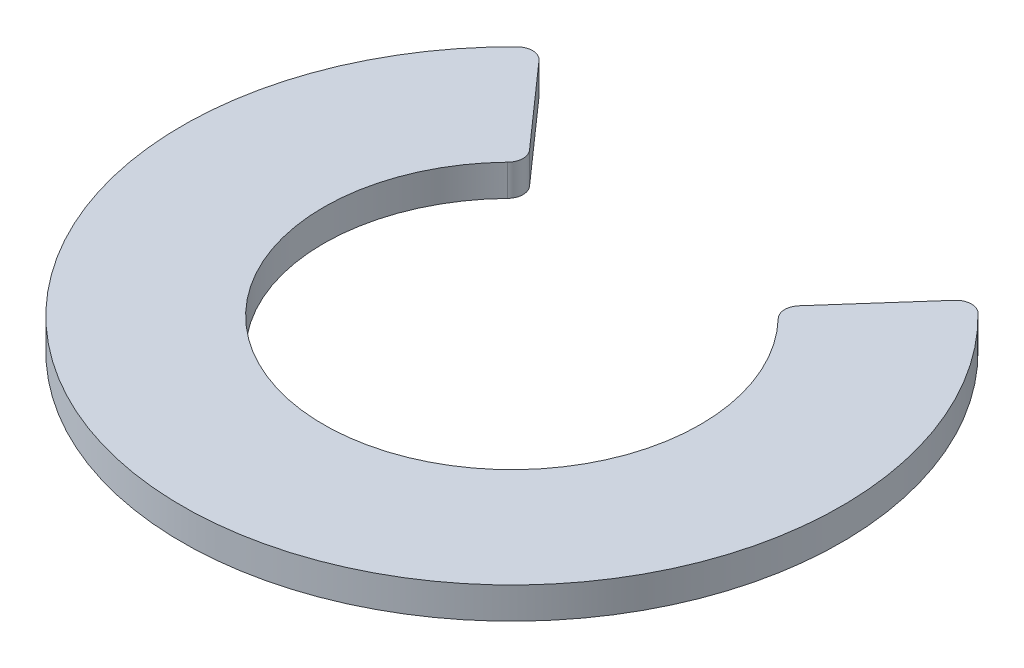
ISO-10303-21;
HEADER;
FILE_DESCRIPTION(('STEP AP214'),'2;1');
FILE_NAME('part.step','',(''),(''),'','','');
FILE_SCHEMA(('AUTOMOTIVE_DESIGN { 1 0 10303 214 1 1 1 1 }'));
ENDSEC;
DATA;
#1=APPLICATION_CONTEXT('core data for automotive mechanical design processes');
#2=APPLICATION_PROTOCOL_DEFINITION('international standard','automotive_design',2000,#1);
#3=PRODUCT_CONTEXT('',#1,'mechanical');
#4=PRODUCT('Part','Part','',(#3));
#5=PRODUCT_RELATED_PRODUCT_CATEGORY('part','',(#4));
#6=PRODUCT_DEFINITION_FORMATION('','',#4);
#7=PRODUCT_DEFINITION_CONTEXT('part definition',#1,'design');
#8=PRODUCT_DEFINITION('design','',#6,#7);
#9=PRODUCT_DEFINITION_SHAPE('','',#8);
#10=(LENGTH_UNIT() NAMED_UNIT(*) SI_UNIT(.MILLI.,.METRE.));
#11=(NAMED_UNIT(*) PLANE_ANGLE_UNIT() SI_UNIT($,.RADIAN.));
#12=(NAMED_UNIT(*) SI_UNIT($,.STERADIAN.) SOLID_ANGLE_UNIT());
#13=UNCERTAINTY_MEASURE_WITH_UNIT(LENGTH_MEASURE(1.E-05),#10,'distance_accuracy_value','');
#14=(GEOMETRIC_REPRESENTATION_CONTEXT(3) GLOBAL_UNCERTAINTY_ASSIGNED_CONTEXT((#13)) GLOBAL_UNIT_ASSIGNED_CONTEXT((#10,
#11,#12)) REPRESENTATION_CONTEXT('',''));
#15=CARTESIAN_POINT('',(0.,0.,0.));
#16=DIRECTION('',(0.,0.,1.));
#17=DIRECTION('',(1.,0.,0.));
#18=AXIS2_PLACEMENT_3D('',#15,#16,#17);
#19=CARTESIAN_POINT('',(0.,0.2,0.));
#20=DIRECTION('',(0.,-1.,0.));
#21=DIRECTION('',(0.,0.,-1.));
#22=AXIS2_PLACEMENT_3D('',#19,#20,#21);
#23=CYLINDRICAL_SURFACE('',#22,2.1);
#24=CARTESIAN_POINT('',(0.,0.,0.));
#25=DIRECTION('',(0.,1.,0.));
#26=DIRECTION('',(0.,0.,1.));
#27=AXIS2_PLACEMENT_3D('',#24,#25,#26);
#28=CIRCLE('',#27,2.1);
#29=CARTESIAN_POINT('',(-1.46836085583703,0.,-1.5013048980955));
#30=VERTEX_POINT('',#29);
#31=CARTESIAN_POINT('',(1.46836085583703,0.,-1.5013048980955));
#32=VERTEX_POINT('',#31);
#33=EDGE_CURVE('E129',#30,#32,#28,.T.);
#34=ORIENTED_EDGE('',*,*,#33,.T.);
#35=DIRECTION('',(0.,-1.,0.));
#36=VECTOR('',#35,1.);
#37=CARTESIAN_POINT('',(1.46836085583703,0.2,-1.5013048980955));
#38=LINE('',#37,#36);
#39=CARTESIAN_POINT('',(1.46836085583703,0.2,-1.5013048980955));
#40=VERTEX_POINT('',#39);
#41=EDGE_CURVE('E152',#32,#40,#38,.F.);
#42=ORIENTED_EDGE('',*,*,#41,.T.);
#43=CARTESIAN_POINT('',(0.,0.2,0.));
#44=DIRECTION('',(0.,1.,0.));
#45=DIRECTION('',(0.,0.,1.));
#46=AXIS2_PLACEMENT_3D('',#43,#44,#45);
#47=CIRCLE('',#46,2.1);
#48=CARTESIAN_POINT('',(-1.46836085583703,0.2,-1.5013048980955));
#49=VERTEX_POINT('',#48);
#50=EDGE_CURVE('E127',#49,#40,#47,.T.);
#51=ORIENTED_EDGE('',*,*,#50,.F.);
#52=DIRECTION('',(0.,-1.,0.));
#53=VECTOR('',#52,1.);
#54=CARTESIAN_POINT('',(-1.46836085583703,0.2,-1.5013048980955));
#55=LINE('',#54,#53);
#56=EDGE_CURVE('E149',#49,#30,#55,.T.);
#57=ORIENTED_EDGE('',*,*,#56,.T.);
#58=EDGE_LOOP('',(#34,#42,#51,#57));
#59=FACE_BOUND('',#58,.T.);
#60=ADVANCED_FACE('F34',(#59),#23,.T.);
#61=CARTESIAN_POINT('',(0.795119435011055,0.2,-0.89876864880107));
#62=DIRECTION('',(0.748973874000887,0.,0.662599529175885));
#63=DIRECTION('',(0.662599529175885,0.,-0.748973874000887));
#64=AXIS2_PLACEMENT_3D('',#61,#62,#63);
#65=PLANE('',#64);
#66=DIRECTION('',(-0.662599529175885,0.,0.748973874000887));
#67=VECTOR('',#66,1.);
#68=CARTESIAN_POINT('',(0.795119435011055,0.,-0.89876864880107));
#69=LINE('',#68,#67);
#70=CARTESIAN_POINT('',(1.32354152292089,0.,-1.49607414157997));
#71=VERTEX_POINT('',#70);
#72=CARTESIAN_POINT('',(0.858827147095202,0.,-0.970781093456356));
#73=VERTEX_POINT('',#72);
#74=EDGE_CURVE('E125',#71,#73,#69,.T.);
#75=ORIENTED_EDGE('',*,*,#74,.T.);
#76=DIRECTION('',(0.,-1.,0.));
#77=VECTOR('',#76,1.);
#78=CARTESIAN_POINT('',(0.858827147095202,0.2,-0.970781093456356));
#79=LINE('',#78,#77);
#80=CARTESIAN_POINT('',(0.858827147095202,0.2,-0.970781093456356));
#81=VERTEX_POINT('',#80);
#82=EDGE_CURVE('E104',#73,#81,#79,.F.);
#83=ORIENTED_EDGE('',*,*,#82,.T.);
#84=DIRECTION('',(-0.662599529175885,0.,0.748973874000887));
#85=VECTOR('',#84,1.);
#86=CARTESIAN_POINT('',(0.795119435011055,0.2,-0.89876864880107));
#87=LINE('',#86,#85);
#88=CARTESIAN_POINT('',(1.32354152292089,0.2,-1.49607414157997));
#89=VERTEX_POINT('',#88);
#90=EDGE_CURVE('E168',#89,#81,#87,.T.);
#91=ORIENTED_EDGE('',*,*,#90,.F.);
#92=DIRECTION('',(0.,-1.,0.));
#93=VECTOR('',#92,1.);
#94=CARTESIAN_POINT('',(1.32354152292089,0.2,-1.49607414157997));
#95=LINE('',#94,#93);
#96=EDGE_CURVE('E109',#89,#71,#95,.T.);
#97=ORIENTED_EDGE('',*,*,#96,.T.);
#98=EDGE_LOOP('',(#75,#83,#91,#97));
#99=FACE_BOUND('',#98,.T.);
#100=ADVANCED_FACE('F185',(#99),#65,.F.);
#101=CARTESIAN_POINT('',(0.,0.2,0.));
#102=DIRECTION('',(0.,-1.,0.));
#103=DIRECTION('',(0.,0.,-1.));
#104=AXIS2_PLACEMENT_3D('',#101,#102,#103);
#105=CYLINDRICAL_SURFACE('',#104,1.2);
#106=CARTESIAN_POINT('',(0.,0.2,0.));
#107=DIRECTION('',(0.,-1.,0.));
#108=DIRECTION('',(0.,0.,1.));
#109=AXIS2_PLACEMENT_3D('',#106,#107,#108);
#110=CIRCLE('',#109,1.2);
#111=CARTESIAN_POINT('',(0.861899570303345,0.2,-0.834942591266555));
#112=VERTEX_POINT('',#111);
#113=CARTESIAN_POINT('',(-0.861899570303345,0.2,-0.834942591266555));
#114=VERTEX_POINT('',#113);
#115=EDGE_CURVE('E118',#112,#114,#110,.T.);
#116=ORIENTED_EDGE('',*,*,#115,.F.);
#117=DIRECTION('',(0.,-1.,0.));
#118=VECTOR('',#117,1.);
#119=CARTESIAN_POINT('',(0.861899570303345,0.2,-0.834942591266555));
#120=LINE('',#119,#118);
#121=CARTESIAN_POINT('',(0.861899570303345,0.,-0.834942591266555));
#122=VERTEX_POINT('',#121);
#123=EDGE_CURVE('E103',#112,#122,#120,.T.);
#124=ORIENTED_EDGE('',*,*,#123,.T.);
#125=CARTESIAN_POINT('',(0.,0.,0.));
#126=DIRECTION('',(0.,-1.,0.));
#127=DIRECTION('',(0.,0.,1.));
#128=AXIS2_PLACEMENT_3D('',#125,#126,#127);
#129=CIRCLE('',#128,1.2);
#130=CARTESIAN_POINT('',(-0.861899570303345,0.,-0.834942591266555));
#131=VERTEX_POINT('',#130);
#132=EDGE_CURVE('E116',#122,#131,#129,.T.);
#133=ORIENTED_EDGE('',*,*,#132,.T.);
#134=DIRECTION('',(0.,-1.,0.));
#135=VECTOR('',#134,1.);
#136=CARTESIAN_POINT('',(-0.861899570303345,0.2,-0.834942591266555));
#137=LINE('',#136,#135);
#138=EDGE_CURVE('E120',#131,#114,#137,.F.);
#139=ORIENTED_EDGE('',*,*,#138,.T.);
#140=EDGE_LOOP('',(#116,#124,#133,#139));
#141=FACE_BOUND('',#140,.T.);
#142=ADVANCED_FACE('F115',(#141),#105,.F.);
#143=CARTESIAN_POINT('',(-1.39145901126935,0.2,-1.57284513540187));
#144=DIRECTION('',(-0.748973874000887,0.,0.662599529175885));
#145=DIRECTION('',(0.662599529175885,0.,0.748973874000887));
#146=AXIS2_PLACEMENT_3D('',#143,#144,#145);
#147=PLANE('',#146);
#148=DIRECTION('',(-0.662599529175885,0.,-0.748973874000887));
#149=VECTOR('',#148,1.);
#150=CARTESIAN_POINT('',(-1.39145901126935,0.,-1.57284513540187));
#151=LINE('',#150,#149);
#152=CARTESIAN_POINT('',(-0.858827147095202,0.,-0.970781093456356));
#153=VERTEX_POINT('',#152);
#154=CARTESIAN_POINT('',(-1.32354152292089,0.,-1.49607414157997));
#155=VERTEX_POINT('',#154);
#156=EDGE_CURVE('E124',#153,#155,#151,.T.);
#157=ORIENTED_EDGE('',*,*,#156,.T.);
#158=DIRECTION('',(0.,-1.,0.));
#159=VECTOR('',#158,1.);
#160=CARTESIAN_POINT('',(-1.32354152292089,0.2,-1.49607414157997));
#161=LINE('',#160,#159);
#162=CARTESIAN_POINT('',(-1.32354152292089,0.2,-1.49607414157997));
#163=VERTEX_POINT('',#162);
#164=EDGE_CURVE('E11',#155,#163,#161,.F.);
#165=ORIENTED_EDGE('',*,*,#164,.T.);
#166=DIRECTION('',(-0.662599529175885,0.,-0.748973874000887));
#167=VECTOR('',#166,1.);
#168=CARTESIAN_POINT('',(-1.39145901126935,0.2,-1.57284513540187));
#169=LINE('',#168,#167);
#170=CARTESIAN_POINT('',(-0.858827147095202,0.2,-0.970781093456356));
#171=VERTEX_POINT('',#170);
#172=EDGE_CURVE('E133',#171,#163,#169,.T.);
#173=ORIENTED_EDGE('',*,*,#172,.F.);
#174=DIRECTION('',(0.,-1.,0.));
#175=VECTOR('',#174,1.);
#176=CARTESIAN_POINT('',(-0.858827147095202,0.2,-0.970781093456356));
#177=LINE('',#176,#175);
#178=EDGE_CURVE('E42',#171,#153,#177,.T.);
#179=ORIENTED_EDGE('',*,*,#178,.T.);
#180=EDGE_LOOP('',(#157,#165,#173,#179));
#181=FACE_BOUND('',#180,.T.);
#182=ADVANCED_FACE('F155',(#181),#147,.F.);
#183=CARTESIAN_POINT('',(0.,0.2,0.));
#184=DIRECTION('',(0.,1.,0.));
#185=DIRECTION('',(0.,0.,1.));
#186=AXIS2_PLACEMENT_3D('',#183,#184,#185);
#187=PLANE('',#186);
#188=ORIENTED_EDGE('',*,*,#90,.T.);
#189=CARTESIAN_POINT('',(0.933724534495291,0.2,-0.904521140538768));
#190=DIRECTION('',(0.,1.,0.));
#191=DIRECTION('',(0.,0.,1.));
#192=AXIS2_PLACEMENT_3D('',#189,#190,#191);
#193=CIRCLE('',#192,0.1);
#194=EDGE_CURVE('E147',#81,#112,#193,.T.);
#195=ORIENTED_EDGE('',*,*,#194,.T.);
#196=ORIENTED_EDGE('',*,*,#115,.T.);
#197=CARTESIAN_POINT('',(-0.933724534495291,0.2,-0.904521140538768));
#198=DIRECTION('',(0.,1.,0.));
#199=DIRECTION('',(0.,0.,1.));
#200=AXIS2_PLACEMENT_3D('',#197,#198,#199);
#201=CIRCLE('',#200,0.1);
#202=EDGE_CURVE('E54',#114,#171,#201,.T.);
#203=ORIENTED_EDGE('',*,*,#202,.T.);
#204=ORIENTED_EDGE('',*,*,#172,.T.);
#205=CARTESIAN_POINT('',(-1.39843891032098,0.2,-1.42981418866238));
#206=DIRECTION('',(0.,1.,0.));
#207=DIRECTION('',(0.,0.,1.));
#208=AXIS2_PLACEMENT_3D('',#205,#206,#207);
#209=CIRCLE('',#208,0.1);
#210=EDGE_CURVE('E143',#163,#49,#209,.T.);
#211=ORIENTED_EDGE('',*,*,#210,.T.);
#212=ORIENTED_EDGE('',*,*,#50,.T.);
#213=CARTESIAN_POINT('',(1.39843891032098,0.2,-1.42981418866238));
#214=DIRECTION('',(0.,1.,0.));
#215=DIRECTION('',(0.,0.,1.));
#216=AXIS2_PLACEMENT_3D('',#213,#214,#215);
#217=CIRCLE('',#216,0.1);
#218=EDGE_CURVE('E145',#40,#89,#217,.T.);
#219=ORIENTED_EDGE('',*,*,#218,.T.);
#220=EDGE_LOOP('',(#188,#195,#196,#203,#204,#211,#212,#219));
#221=FACE_BOUND('',#220,.T.);
#222=ADVANCED_FACE('F174',(#221),#187,.T.);
#223=CARTESIAN_POINT('',(0.,0.,0.));
#224=DIRECTION('',(0.,1.,0.));
#225=DIRECTION('',(0.,0.,1.));
#226=AXIS2_PLACEMENT_3D('',#223,#224,#225);
#227=PLANE('',#226);
#228=ORIENTED_EDGE('',*,*,#132,.F.);
#229=CARTESIAN_POINT('',(0.933724534495291,0.,-0.904521140538768));
#230=DIRECTION('',(0.,1.,0.));
#231=DIRECTION('',(0.,0.,1.));
#232=AXIS2_PLACEMENT_3D('',#229,#230,#231);
#233=CIRCLE('',#232,0.1);
#234=EDGE_CURVE('E99',#122,#73,#233,.F.);
#235=ORIENTED_EDGE('',*,*,#234,.T.);
#236=ORIENTED_EDGE('',*,*,#74,.F.);
#237=CARTESIAN_POINT('',(1.39843891032098,0.,-1.42981418866238));
#238=DIRECTION('',(0.,1.,0.));
#239=DIRECTION('',(0.,0.,1.));
#240=AXIS2_PLACEMENT_3D('',#237,#238,#239);
#241=CIRCLE('',#240,0.1);
#242=EDGE_CURVE('E110',#71,#32,#241,.F.);
#243=ORIENTED_EDGE('',*,*,#242,.T.);
#244=ORIENTED_EDGE('',*,*,#33,.F.);
#245=CARTESIAN_POINT('',(-1.39843891032098,0.,-1.42981418866238));
#246=DIRECTION('',(0.,1.,0.));
#247=DIRECTION('',(0.,0.,1.));
#248=AXIS2_PLACEMENT_3D('',#245,#246,#247);
#249=CIRCLE('',#248,0.1);
#250=EDGE_CURVE('E136',#30,#155,#249,.F.);
#251=ORIENTED_EDGE('',*,*,#250,.T.);
#252=ORIENTED_EDGE('',*,*,#156,.F.);
#253=CARTESIAN_POINT('',(-0.933724534495291,0.,-0.904521140538768));
#254=DIRECTION('',(0.,1.,0.));
#255=DIRECTION('',(0.,0.,1.));
#256=AXIS2_PLACEMENT_3D('',#253,#254,#255);
#257=CIRCLE('',#256,0.1);
#258=EDGE_CURVE('E119',#153,#131,#257,.F.);
#259=ORIENTED_EDGE('',*,*,#258,.T.);
#260=EDGE_LOOP('',(#228,#235,#236,#243,#244,#251,#252,#259));
#261=FACE_BOUND('',#260,.T.);
#262=ADVANCED_FACE('F122',(#261),#227,.F.);
#263=CARTESIAN_POINT('',(0.933724534495291,0.2,-0.904521140538768));
#264=DIRECTION('',(0.,-1.,0.));
#265=DIRECTION('',(0.,0.,-1.));
#266=AXIS2_PLACEMENT_3D('',#263,#264,#265);
#267=CYLINDRICAL_SURFACE('',#266,0.1);
#268=ORIENTED_EDGE('',*,*,#194,.F.);
#269=ORIENTED_EDGE('',*,*,#82,.F.);
#270=ORIENTED_EDGE('',*,*,#234,.F.);
#271=ORIENTED_EDGE('',*,*,#123,.F.);
#272=EDGE_LOOP('',(#268,#269,#270,#271));
#273=FACE_BOUND('',#272,.T.);
#274=ADVANCED_FACE('F102',(#273),#267,.T.);
#275=CARTESIAN_POINT('',(1.39843891032098,0.2,-1.42981418866238));
#276=DIRECTION('',(0.,-1.,0.));
#277=DIRECTION('',(0.,0.,-1.));
#278=AXIS2_PLACEMENT_3D('',#275,#276,#277);
#279=CYLINDRICAL_SURFACE('',#278,0.1);
#280=ORIENTED_EDGE('',*,*,#218,.F.);
#281=ORIENTED_EDGE('',*,*,#41,.F.);
#282=ORIENTED_EDGE('',*,*,#242,.F.);
#283=ORIENTED_EDGE('',*,*,#96,.F.);
#284=EDGE_LOOP('',(#280,#281,#282,#283));
#285=FACE_BOUND('',#284,.T.);
#286=ADVANCED_FACE('F196',(#285),#279,.T.);
#287=CARTESIAN_POINT('',(-1.39843891032098,0.2,-1.42981418866238));
#288=DIRECTION('',(0.,-1.,0.));
#289=DIRECTION('',(0.,0.,-1.));
#290=AXIS2_PLACEMENT_3D('',#287,#288,#289);
#291=CYLINDRICAL_SURFACE('',#290,0.1);
#292=ORIENTED_EDGE('',*,*,#210,.F.);
#293=ORIENTED_EDGE('',*,*,#164,.F.);
#294=ORIENTED_EDGE('',*,*,#250,.F.);
#295=ORIENTED_EDGE('',*,*,#56,.F.);
#296=EDGE_LOOP('',(#292,#293,#294,#295));
#297=FACE_BOUND('',#296,.T.);
#298=ADVANCED_FACE('F162',(#297),#291,.T.);
#299=CARTESIAN_POINT('',(-0.933724534495291,0.2,-0.904521140538768));
#300=DIRECTION('',(0.,-1.,0.));
#301=DIRECTION('',(0.,0.,-1.));
#302=AXIS2_PLACEMENT_3D('',#299,#300,#301);
#303=CYLINDRICAL_SURFACE('',#302,0.1);
#304=ORIENTED_EDGE('',*,*,#202,.F.);
#305=ORIENTED_EDGE('',*,*,#138,.F.);
#306=ORIENTED_EDGE('',*,*,#258,.F.);
#307=ORIENTED_EDGE('',*,*,#178,.F.);
#308=EDGE_LOOP('',(#304,#305,#306,#307));
#309=FACE_BOUND('',#308,.T.);
#310=ADVANCED_FACE('F36',(#309),#303,.T.);
#311=CLOSED_SHELL('',(#60,#100,#142,#182,#222,#262,#274,#286,#298,#310));
#312=MANIFOLD_SOLID_BREP('B2',#311);
#313=ADVANCED_BREP_SHAPE_REPRESENTATION('',(#18,#312),#14);
#314=SHAPE_DEFINITION_REPRESENTATION(#9,#313);
ENDSEC;
END-ISO-10303-21;
